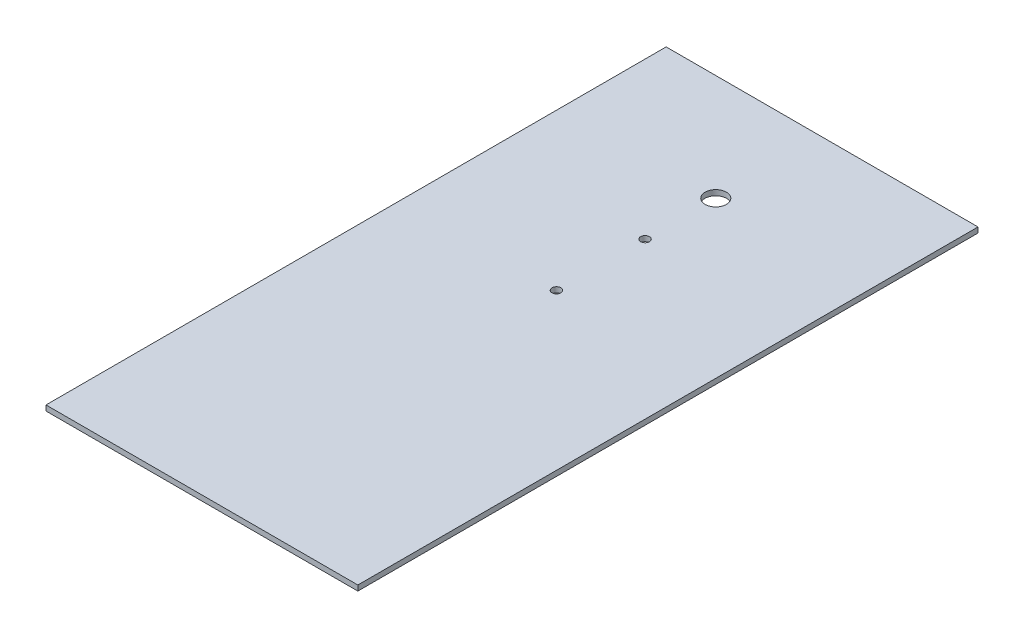
ISO-10303-21;
HEADER;
FILE_DESCRIPTION(('STEP AP214'),'2;1');
FILE_NAME('part.step','',(''),(''),'','','');
FILE_SCHEMA(('AUTOMOTIVE_DESIGN { 1 0 10303 214 1 1 1 1 }'));
ENDSEC;
DATA;
#1=APPLICATION_CONTEXT('core data for automotive mechanical design processes');
#2=APPLICATION_PROTOCOL_DEFINITION('international standard','automotive_design',2000,#1);
#3=PRODUCT_CONTEXT('',#1,'mechanical');
#4=PRODUCT('Part','Part','',(#3));
#5=PRODUCT_RELATED_PRODUCT_CATEGORY('part','',(#4));
#6=PRODUCT_DEFINITION_FORMATION('','',#4);
#7=PRODUCT_DEFINITION_CONTEXT('part definition',#1,'design');
#8=PRODUCT_DEFINITION('design','',#6,#7);
#9=PRODUCT_DEFINITION_SHAPE('','',#8);
#10=(LENGTH_UNIT() NAMED_UNIT(*) SI_UNIT(.MILLI.,.METRE.));
#11=(NAMED_UNIT(*) PLANE_ANGLE_UNIT() SI_UNIT($,.RADIAN.));
#12=(NAMED_UNIT(*) SI_UNIT($,.STERADIAN.) SOLID_ANGLE_UNIT());
#13=UNCERTAINTY_MEASURE_WITH_UNIT(LENGTH_MEASURE(1.E-05),#10,'distance_accuracy_value','');
#14=(GEOMETRIC_REPRESENTATION_CONTEXT(3) GLOBAL_UNCERTAINTY_ASSIGNED_CONTEXT((#13)) GLOBAL_UNIT_ASSIGNED_CONTEXT((#10,
#11,#12)) REPRESENTATION_CONTEXT('',''));
#15=CARTESIAN_POINT('',(0.,0.,0.));
#16=DIRECTION('',(0.,0.,1.));
#17=DIRECTION('',(1.,0.,0.));
#18=AXIS2_PLACEMENT_3D('',#15,#16,#17);
#19=CARTESIAN_POINT('',(0.,3.,0.));
#20=DIRECTION('',(1.,0.,0.));
#21=DIRECTION('',(0.,0.,-1.));
#22=AXIS2_PLACEMENT_3D('',#19,#20,#21);
#23=PLANE('',#22);
#24=DIRECTION('',(0.,0.,1.));
#25=VECTOR('',#24,1.);
#26=CARTESIAN_POINT('',(0.,0.,0.));
#27=LINE('',#26,#25);
#28=CARTESIAN_POINT('',(0.,0.,-350.));
#29=VERTEX_POINT('',#28);
#30=CARTESIAN_POINT('',(0.,0.,0.));
#31=VERTEX_POINT('',#30);
#32=EDGE_CURVE('E101',#29,#31,#27,.T.);
#33=ORIENTED_EDGE('',*,*,#32,.T.);
#34=DIRECTION('',(0.,-1.,0.));
#35=VECTOR('',#34,1.);
#36=CARTESIAN_POINT('',(0.,3.,0.));
#37=LINE('',#36,#35);
#38=CARTESIAN_POINT('',(0.,3.,0.));
#39=VERTEX_POINT('',#38);
#40=EDGE_CURVE('E11',#39,#31,#37,.T.);
#41=ORIENTED_EDGE('',*,*,#40,.F.);
#42=DIRECTION('',(0.,0.,1.));
#43=VECTOR('',#42,1.);
#44=CARTESIAN_POINT('',(0.,3.,0.));
#45=LINE('',#44,#43);
#46=CARTESIAN_POINT('',(0.,3.,-350.));
#47=VERTEX_POINT('',#46);
#48=EDGE_CURVE('E89',#47,#39,#45,.T.);
#49=ORIENTED_EDGE('',*,*,#48,.F.);
#50=DIRECTION('',(0.,-1.,0.));
#51=VECTOR('',#50,1.);
#52=CARTESIAN_POINT('',(0.,3.,-350.));
#53=LINE('',#52,#51);
#54=EDGE_CURVE('E97',#47,#29,#53,.T.);
#55=ORIENTED_EDGE('',*,*,#54,.T.);
#56=EDGE_LOOP('',(#33,#41,#49,#55));
#57=FACE_BOUND('',#56,.T.);
#58=ADVANCED_FACE('F38',(#57),#23,.F.);
#59=CARTESIAN_POINT('',(0.,3.,0.));
#60=DIRECTION('',(0.,0.,-1.));
#61=DIRECTION('',(-1.,0.,0.));
#62=AXIS2_PLACEMENT_3D('',#59,#60,#61);
#63=PLANE('',#62);
#64=DIRECTION('',(1.,0.,0.));
#65=VECTOR('',#64,1.);
#66=CARTESIAN_POINT('',(0.,0.,0.));
#67=LINE('',#66,#65);
#68=CARTESIAN_POINT('',(176.,0.,0.));
#69=VERTEX_POINT('',#68);
#70=EDGE_CURVE('E93',#31,#69,#67,.T.);
#71=ORIENTED_EDGE('',*,*,#70,.T.);
#72=DIRECTION('',(0.,-1.,0.));
#73=VECTOR('',#72,1.);
#74=CARTESIAN_POINT('',(176.,3.,0.));
#75=LINE('',#74,#73);
#76=CARTESIAN_POINT('',(176.,3.,0.));
#77=VERTEX_POINT('',#76);
#78=EDGE_CURVE('E46',#77,#69,#75,.T.);
#79=ORIENTED_EDGE('',*,*,#78,.F.);
#80=DIRECTION('',(1.,0.,0.));
#81=VECTOR('',#80,1.);
#82=CARTESIAN_POINT('',(0.,3.,0.));
#83=LINE('',#82,#81);
#84=EDGE_CURVE('E84',#39,#77,#83,.T.);
#85=ORIENTED_EDGE('',*,*,#84,.F.);
#86=ORIENTED_EDGE('',*,*,#40,.T.);
#87=EDGE_LOOP('',(#71,#79,#85,#86));
#88=FACE_BOUND('',#87,.T.);
#89=ADVANCED_FACE('F92',(#88),#63,.F.);
#90=CARTESIAN_POINT('',(176.,3.,0.));
#91=DIRECTION('',(-1.,0.,0.));
#92=DIRECTION('',(0.,0.,1.));
#93=AXIS2_PLACEMENT_3D('',#90,#91,#92);
#94=PLANE('',#93);
#95=DIRECTION('',(0.,0.,-1.));
#96=VECTOR('',#95,1.);
#97=CARTESIAN_POINT('',(176.,0.,0.));
#98=LINE('',#97,#96);
#99=CARTESIAN_POINT('',(176.,0.,-350.));
#100=VERTEX_POINT('',#99);
#101=EDGE_CURVE('E71',#69,#100,#98,.T.);
#102=ORIENTED_EDGE('',*,*,#101,.T.);
#103=DIRECTION('',(0.,-1.,0.));
#104=VECTOR('',#103,1.);
#105=CARTESIAN_POINT('',(176.,3.,-350.));
#106=LINE('',#105,#104);
#107=CARTESIAN_POINT('',(176.,3.,-350.));
#108=VERTEX_POINT('',#107);
#109=EDGE_CURVE('E94',#108,#100,#106,.T.);
#110=ORIENTED_EDGE('',*,*,#109,.F.);
#111=DIRECTION('',(0.,0.,-1.));
#112=VECTOR('',#111,1.);
#113=CARTESIAN_POINT('',(176.,3.,0.));
#114=LINE('',#113,#112);
#115=EDGE_CURVE('E87',#77,#108,#114,.T.);
#116=ORIENTED_EDGE('',*,*,#115,.F.);
#117=ORIENTED_EDGE('',*,*,#78,.T.);
#118=EDGE_LOOP('',(#102,#110,#116,#117));
#119=FACE_BOUND('',#118,.T.);
#120=ADVANCED_FACE('F95',(#119),#94,.F.);
#121=CARTESIAN_POINT('',(0.,3.,-350.));
#122=DIRECTION('',(0.,0.,1.));
#123=DIRECTION('',(1.,0.,0.));
#124=AXIS2_PLACEMENT_3D('',#121,#122,#123);
#125=PLANE('',#124);
#126=DIRECTION('',(-1.,0.,0.));
#127=VECTOR('',#126,1.);
#128=CARTESIAN_POINT('',(0.,0.,-350.));
#129=LINE('',#128,#127);
#130=EDGE_CURVE('E77',#100,#29,#129,.T.);
#131=ORIENTED_EDGE('',*,*,#130,.T.);
#132=ORIENTED_EDGE('',*,*,#54,.F.);
#133=DIRECTION('',(-1.,0.,0.));
#134=VECTOR('',#133,1.);
#135=CARTESIAN_POINT('',(0.,3.,-350.));
#136=LINE('',#135,#134);
#137=EDGE_CURVE('E54',#108,#47,#136,.T.);
#138=ORIENTED_EDGE('',*,*,#137,.F.);
#139=ORIENTED_EDGE('',*,*,#109,.T.);
#140=EDGE_LOOP('',(#131,#132,#138,#139));
#141=FACE_BOUND('',#140,.T.);
#142=ADVANCED_FACE('F109',(#141),#125,.F.);
#143=CARTESIAN_POINT('',(0.,3.,0.));
#144=DIRECTION('',(0.,-1.,0.));
#145=DIRECTION('',(0.,0.,-1.));
#146=AXIS2_PLACEMENT_3D('',#143,#144,#145);
#147=PLANE('',#146);
#148=CARTESIAN_POINT('',(87.9999999999999,3.,-290.));
#149=DIRECTION('',(0.,-1.,0.));
#150=DIRECTION('',(0.,0.,-1.));
#151=AXIS2_PLACEMENT_3D('',#148,#149,#150);
#152=CIRCLE('',#151,6.00000000000001);
#153=CARTESIAN_POINT('',(87.9999999999999,3.,-296.));
#154=VERTEX_POINT('',#153);
#155=EDGE_CURVE('E126',#154,#154,#152,.T.);
#156=ORIENTED_EDGE('',*,*,#155,.T.);
#157=EDGE_LOOP('',(#156));
#158=FACE_BOUND('',#157,.T.);
#159=CARTESIAN_POINT('',(88.0169131386238,3.,-250.06));
#160=DIRECTION('',(0.,-1.,0.));
#161=DIRECTION('',(0.,0.,-1.));
#162=AXIS2_PLACEMENT_3D('',#159,#160,#161);
#163=CIRCLE('',#162,2.5);
#164=CARTESIAN_POINT('',(88.0169131386238,3.,-252.56));
#165=VERTEX_POINT('',#164);
#166=EDGE_CURVE('E120',#165,#165,#163,.T.);
#167=ORIENTED_EDGE('',*,*,#166,.T.);
#168=EDGE_LOOP('',(#167));
#169=FACE_BOUND('',#168,.T.);
#170=CARTESIAN_POINT('',(88.0169131386238,3.,-200.06));
#171=DIRECTION('',(0.,-1.,0.));
#172=DIRECTION('',(0.,0.,-1.));
#173=AXIS2_PLACEMENT_3D('',#170,#171,#172);
#174=CIRCLE('',#173,2.5);
#175=CARTESIAN_POINT('',(88.0169131386238,3.,-202.56));
#176=VERTEX_POINT('',#175);
#177=EDGE_CURVE('E104',#176,#176,#174,.T.);
#178=ORIENTED_EDGE('',*,*,#177,.T.);
#179=EDGE_LOOP('',(#178));
#180=FACE_BOUND('',#179,.T.);
#181=ORIENTED_EDGE('',*,*,#48,.T.);
#182=ORIENTED_EDGE('',*,*,#84,.T.);
#183=ORIENTED_EDGE('',*,*,#115,.T.);
#184=ORIENTED_EDGE('',*,*,#137,.T.);
#185=EDGE_LOOP('',(#181,#182,#183,#184));
#186=FACE_BOUND('',#185,.T.);
#187=ADVANCED_FACE('F85',(#158,#169,#180,#186),#147,.F.);
#188=CARTESIAN_POINT('',(0.,0.,0.));
#189=DIRECTION('',(0.,-1.,0.));
#190=DIRECTION('',(0.,0.,-1.));
#191=AXIS2_PLACEMENT_3D('',#188,#189,#190);
#192=PLANE('',#191);
#193=CARTESIAN_POINT('',(87.9999999999999,0.,-290.));
#194=DIRECTION('',(0.,-1.,0.));
#195=DIRECTION('',(0.,0.,-1.));
#196=AXIS2_PLACEMENT_3D('',#193,#194,#195);
#197=CIRCLE('',#196,6.00000000000001);
#198=CARTESIAN_POINT('',(87.9999999999999,0.,-296.));
#199=VERTEX_POINT('',#198);
#200=EDGE_CURVE('E129',#199,#199,#197,.T.);
#201=ORIENTED_EDGE('',*,*,#200,.F.);
#202=EDGE_LOOP('',(#201));
#203=FACE_BOUND('',#202,.T.);
#204=CARTESIAN_POINT('',(88.0169131386238,0.,-250.06));
#205=DIRECTION('',(0.,-1.,0.));
#206=DIRECTION('',(0.,0.,-1.));
#207=AXIS2_PLACEMENT_3D('',#204,#205,#206);
#208=CIRCLE('',#207,2.5);
#209=CARTESIAN_POINT('',(88.0169131386238,0.,-252.56));
#210=VERTEX_POINT('',#209);
#211=EDGE_CURVE('E123',#210,#210,#208,.T.);
#212=ORIENTED_EDGE('',*,*,#211,.F.);
#213=EDGE_LOOP('',(#212));
#214=FACE_BOUND('',#213,.T.);
#215=CARTESIAN_POINT('',(88.0169131386238,0.,-200.06));
#216=DIRECTION('',(0.,-1.,0.));
#217=DIRECTION('',(0.,0.,-1.));
#218=AXIS2_PLACEMENT_3D('',#215,#216,#217);
#219=CIRCLE('',#218,2.5);
#220=CARTESIAN_POINT('',(88.0169131386238,0.,-202.56));
#221=VERTEX_POINT('',#220);
#222=EDGE_CURVE('E117',#221,#221,#219,.T.);
#223=ORIENTED_EDGE('',*,*,#222,.F.);
#224=EDGE_LOOP('',(#223));
#225=FACE_BOUND('',#224,.T.);
#226=ORIENTED_EDGE('',*,*,#32,.F.);
#227=ORIENTED_EDGE('',*,*,#130,.F.);
#228=ORIENTED_EDGE('',*,*,#101,.F.);
#229=ORIENTED_EDGE('',*,*,#70,.F.);
#230=EDGE_LOOP('',(#226,#227,#228,#229));
#231=FACE_BOUND('',#230,.T.);
#232=ADVANCED_FACE('F112',(#203,#214,#225,#231),#192,.T.);
#233=CARTESIAN_POINT('',(88.0169131386238,0.,-200.06));
#234=DIRECTION('',(0.,-1.,0.));
#235=DIRECTION('',(0.,0.,-1.));
#236=AXIS2_PLACEMENT_3D('',#233,#234,#235);
#237=CYLINDRICAL_SURFACE('',#236,2.5);
#238=ORIENTED_EDGE('',*,*,#177,.F.);
#239=EDGE_LOOP('',(#238));
#240=FACE_BOUND('',#239,.T.);
#241=ORIENTED_EDGE('',*,*,#222,.T.);
#242=EDGE_LOOP('',(#241));
#243=FACE_BOUND('',#242,.T.);
#244=ADVANCED_FACE('F137',(#240,#243),#237,.F.);
#245=CARTESIAN_POINT('',(88.0169131386238,0.,-250.06));
#246=DIRECTION('',(0.,-1.,0.));
#247=DIRECTION('',(0.,0.,-1.));
#248=AXIS2_PLACEMENT_3D('',#245,#246,#247);
#249=CYLINDRICAL_SURFACE('',#248,2.5);
#250=ORIENTED_EDGE('',*,*,#166,.F.);
#251=EDGE_LOOP('',(#250));
#252=FACE_BOUND('',#251,.T.);
#253=ORIENTED_EDGE('',*,*,#211,.T.);
#254=EDGE_LOOP('',(#253));
#255=FACE_BOUND('',#254,.T.);
#256=ADVANCED_FACE('F144',(#252,#255),#249,.F.);
#257=CARTESIAN_POINT('',(87.9999999999999,0.,-290.));
#258=DIRECTION('',(0.,-1.,0.));
#259=DIRECTION('',(0.,0.,-1.));
#260=AXIS2_PLACEMENT_3D('',#257,#258,#259);
#261=CYLINDRICAL_SURFACE('',#260,6.00000000000001);
#262=ORIENTED_EDGE('',*,*,#155,.F.);
#263=EDGE_LOOP('',(#262));
#264=FACE_BOUND('',#263,.T.);
#265=ORIENTED_EDGE('',*,*,#200,.T.);
#266=EDGE_LOOP('',(#265));
#267=FACE_BOUND('',#266,.T.);
#268=ADVANCED_FACE('F133',(#264,#267),#261,.F.);
#269=CLOSED_SHELL('',(#58,#89,#120,#142,#187,#232,#244,#256,#268));
#270=MANIFOLD_SOLID_BREP('B2',#269);
#271=ADVANCED_BREP_SHAPE_REPRESENTATION('',(#18,#270),#14);
#272=SHAPE_DEFINITION_REPRESENTATION(#9,#271);
ENDSEC;
END-ISO-10303-21;
